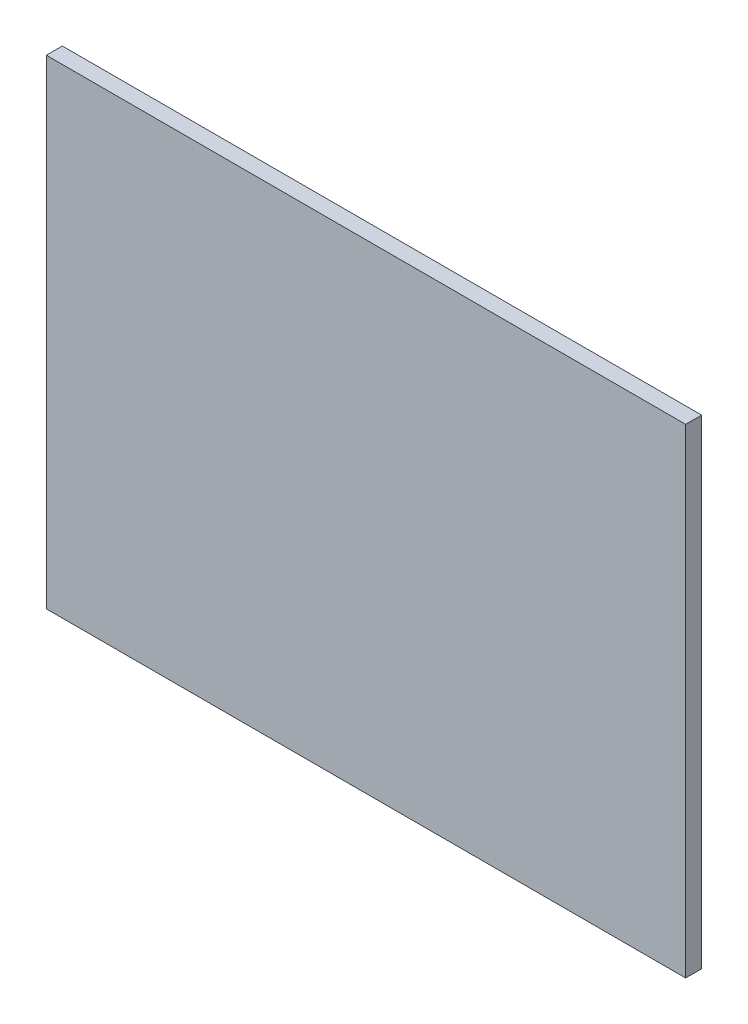
ISO-10303-21;
HEADER;
FILE_DESCRIPTION(('STEP AP214'),'2;1');
FILE_NAME('part.step','',(''),(''),'','','');
FILE_SCHEMA(('AUTOMOTIVE_DESIGN { 1 0 10303 214 1 1 1 1 }'));
ENDSEC;
DATA;
#1=APPLICATION_CONTEXT('core data for automotive mechanical design processes');
#2=APPLICATION_PROTOCOL_DEFINITION('international standard','automotive_design',2000,#1);
#3=PRODUCT_CONTEXT('',#1,'mechanical');
#4=PRODUCT('Part','Part','',(#3));
#5=PRODUCT_RELATED_PRODUCT_CATEGORY('part','',(#4));
#6=PRODUCT_DEFINITION_FORMATION('','',#4);
#7=PRODUCT_DEFINITION_CONTEXT('part definition',#1,'design');
#8=PRODUCT_DEFINITION('design','',#6,#7);
#9=PRODUCT_DEFINITION_SHAPE('','',#8);
#10=(LENGTH_UNIT() NAMED_UNIT(*) SI_UNIT(.MILLI.,.METRE.));
#11=(NAMED_UNIT(*) PLANE_ANGLE_UNIT() SI_UNIT($,.RADIAN.));
#12=(NAMED_UNIT(*) SI_UNIT($,.STERADIAN.) SOLID_ANGLE_UNIT());
#13=UNCERTAINTY_MEASURE_WITH_UNIT(LENGTH_MEASURE(1.E-05),#10,'distance_accuracy_value','');
#14=(GEOMETRIC_REPRESENTATION_CONTEXT(3) GLOBAL_UNCERTAINTY_ASSIGNED_CONTEXT((#13)) GLOBAL_UNIT_ASSIGNED_CONTEXT((#10,
#11,#12)) REPRESENTATION_CONTEXT('',''));
#15=CARTESIAN_POINT('',(0.,0.,0.));
#16=DIRECTION('',(0.,0.,1.));
#17=DIRECTION('',(1.,0.,0.));
#18=AXIS2_PLACEMENT_3D('',#15,#16,#17);
#19=CARTESIAN_POINT('',(-65.8695652173913,48.5869565217391,2.));
#20=DIRECTION('',(1.,0.,0.));
#21=DIRECTION('',(0.,1.,0.));
#22=AXIS2_PLACEMENT_3D('',#19,#20,#21);
#23=PLANE('',#22);
#24=DIRECTION('',(0.,-1.,0.));
#25=VECTOR('',#24,1.);
#26=CARTESIAN_POINT('',(-65.8695652173913,48.5869565217391,0.));
#27=LINE('',#26,#25);
#28=CARTESIAN_POINT('',(-65.8695652173913,48.5869565217391,0.));
#29=VERTEX_POINT('',#28);
#30=CARTESIAN_POINT('',(-65.8695652173913,-11.4130434782609,0.));
#31=VERTEX_POINT('',#30);
#32=EDGE_CURVE('E96',#29,#31,#27,.T.);
#33=ORIENTED_EDGE('',*,*,#32,.T.);
#34=DIRECTION('',(0.,0.,-1.));
#35=VECTOR('',#34,1.);
#36=CARTESIAN_POINT('',(-65.8695652173913,-11.4130434782609,2.));
#37=LINE('',#36,#35);
#38=CARTESIAN_POINT('',(-65.8695652173913,-11.4130434782609,2.));
#39=VERTEX_POINT('',#38);
#40=EDGE_CURVE('E11',#39,#31,#37,.T.);
#41=ORIENTED_EDGE('',*,*,#40,.F.);
#42=DIRECTION('',(0.,-1.,0.));
#43=VECTOR('',#42,1.);
#44=CARTESIAN_POINT('',(-65.8695652173913,48.5869565217391,2.));
#45=LINE('',#44,#43);
#46=CARTESIAN_POINT('',(-65.8695652173913,48.5869565217391,2.));
#47=VERTEX_POINT('',#46);
#48=EDGE_CURVE('E84',#47,#39,#45,.T.);
#49=ORIENTED_EDGE('',*,*,#48,.F.);
#50=DIRECTION('',(0.,0.,-1.));
#51=VECTOR('',#50,1.);
#52=CARTESIAN_POINT('',(-65.8695652173913,48.5869565217391,2.));
#53=LINE('',#52,#51);
#54=EDGE_CURVE('E92',#47,#29,#53,.T.);
#55=ORIENTED_EDGE('',*,*,#54,.T.);
#56=EDGE_LOOP('',(#33,#41,#49,#55));
#57=FACE_BOUND('',#56,.T.);
#58=ADVANCED_FACE('F33',(#57),#23,.F.);
#59=CARTESIAN_POINT('',(-65.8695652173913,-11.4130434782609,2.));
#60=DIRECTION('',(0.,1.,0.));
#61=DIRECTION('',(0.,0.,1.));
#62=AXIS2_PLACEMENT_3D('',#59,#60,#61);
#63=PLANE('',#62);
#64=DIRECTION('',(1.,0.,0.));
#65=VECTOR('',#64,1.);
#66=CARTESIAN_POINT('',(-65.8695652173913,-11.4130434782609,0.));
#67=LINE('',#66,#65);
#68=CARTESIAN_POINT('',(14.1304347826087,-11.4130434782609,0.));
#69=VERTEX_POINT('',#68);
#70=EDGE_CURVE('E88',#31,#69,#67,.T.);
#71=ORIENTED_EDGE('',*,*,#70,.T.);
#72=DIRECTION('',(0.,0.,-1.));
#73=VECTOR('',#72,1.);
#74=CARTESIAN_POINT('',(14.1304347826087,-11.4130434782609,2.));
#75=LINE('',#74,#73);
#76=CARTESIAN_POINT('',(14.1304347826087,-11.4130434782609,2.));
#77=VERTEX_POINT('',#76);
#78=EDGE_CURVE('E41',#77,#69,#75,.T.);
#79=ORIENTED_EDGE('',*,*,#78,.F.);
#80=DIRECTION('',(1.,0.,0.));
#81=VECTOR('',#80,1.);
#82=CARTESIAN_POINT('',(-65.8695652173913,-11.4130434782609,2.));
#83=LINE('',#82,#81);
#84=EDGE_CURVE('E79',#39,#77,#83,.T.);
#85=ORIENTED_EDGE('',*,*,#84,.F.);
#86=ORIENTED_EDGE('',*,*,#40,.T.);
#87=EDGE_LOOP('',(#71,#79,#85,#86));
#88=FACE_BOUND('',#87,.T.);
#89=ADVANCED_FACE('F87',(#88),#63,.F.);
#90=CARTESIAN_POINT('',(14.1304347826087,48.5869565217391,2.));
#91=DIRECTION('',(-1.,0.,0.));
#92=DIRECTION('',(0.,-1.,0.));
#93=AXIS2_PLACEMENT_3D('',#90,#91,#92);
#94=PLANE('',#93);
#95=DIRECTION('',(0.,1.,0.));
#96=VECTOR('',#95,1.);
#97=CARTESIAN_POINT('',(14.1304347826087,48.5869565217391,0.));
#98=LINE('',#97,#96);
#99=CARTESIAN_POINT('',(14.1304347826087,48.5869565217391,0.));
#100=VERTEX_POINT('',#99);
#101=EDGE_CURVE('E66',#69,#100,#98,.T.);
#102=ORIENTED_EDGE('',*,*,#101,.T.);
#103=DIRECTION('',(0.,0.,-1.));
#104=VECTOR('',#103,1.);
#105=CARTESIAN_POINT('',(14.1304347826087,48.5869565217391,2.));
#106=LINE('',#105,#104);
#107=CARTESIAN_POINT('',(14.1304347826087,48.5869565217391,2.));
#108=VERTEX_POINT('',#107);
#109=EDGE_CURVE('E89',#108,#100,#106,.T.);
#110=ORIENTED_EDGE('',*,*,#109,.F.);
#111=DIRECTION('',(0.,1.,0.));
#112=VECTOR('',#111,1.);
#113=CARTESIAN_POINT('',(14.1304347826087,48.5869565217391,2.));
#114=LINE('',#113,#112);
#115=EDGE_CURVE('E82',#77,#108,#114,.T.);
#116=ORIENTED_EDGE('',*,*,#115,.F.);
#117=ORIENTED_EDGE('',*,*,#78,.T.);
#118=EDGE_LOOP('',(#102,#110,#116,#117));
#119=FACE_BOUND('',#118,.T.);
#120=ADVANCED_FACE('F90',(#119),#94,.F.);
#121=CARTESIAN_POINT('',(-65.8695652173913,48.5869565217391,2.));
#122=DIRECTION('',(0.,-1.,0.));
#123=DIRECTION('',(0.,0.,-1.));
#124=AXIS2_PLACEMENT_3D('',#121,#122,#123);
#125=PLANE('',#124);
#126=DIRECTION('',(-1.,0.,0.));
#127=VECTOR('',#126,1.);
#128=CARTESIAN_POINT('',(-65.8695652173913,48.5869565217391,0.));
#129=LINE('',#128,#127);
#130=EDGE_CURVE('E72',#100,#29,#129,.T.);
#131=ORIENTED_EDGE('',*,*,#130,.T.);
#132=ORIENTED_EDGE('',*,*,#54,.F.);
#133=DIRECTION('',(-1.,0.,0.));
#134=VECTOR('',#133,1.);
#135=CARTESIAN_POINT('',(-65.8695652173913,48.5869565217391,2.));
#136=LINE('',#135,#134);
#137=EDGE_CURVE('E49',#108,#47,#136,.T.);
#138=ORIENTED_EDGE('',*,*,#137,.F.);
#139=ORIENTED_EDGE('',*,*,#109,.T.);
#140=EDGE_LOOP('',(#131,#132,#138,#139));
#141=FACE_BOUND('',#140,.T.);
#142=ADVANCED_FACE('F103',(#141),#125,.F.);
#143=CARTESIAN_POINT('',(0.,0.,2.));
#144=DIRECTION('',(0.,0.,1.));
#145=DIRECTION('',(1.,0.,0.));
#146=AXIS2_PLACEMENT_3D('',#143,#144,#145);
#147=PLANE('',#146);
#148=ORIENTED_EDGE('',*,*,#48,.T.);
#149=ORIENTED_EDGE('',*,*,#84,.T.);
#150=ORIENTED_EDGE('',*,*,#115,.T.);
#151=ORIENTED_EDGE('',*,*,#137,.T.);
#152=EDGE_LOOP('',(#148,#149,#150,#151));
#153=FACE_BOUND('',#152,.T.);
#154=ADVANCED_FACE('F80',(#153),#147,.T.);
#155=CARTESIAN_POINT('',(0.,0.,0.));
#156=DIRECTION('',(0.,0.,1.));
#157=DIRECTION('',(1.,0.,0.));
#158=AXIS2_PLACEMENT_3D('',#155,#156,#157);
#159=PLANE('',#158);
#160=ORIENTED_EDGE('',*,*,#32,.F.);
#161=ORIENTED_EDGE('',*,*,#130,.F.);
#162=ORIENTED_EDGE('',*,*,#101,.F.);
#163=ORIENTED_EDGE('',*,*,#70,.F.);
#164=EDGE_LOOP('',(#160,#161,#162,#163));
#165=FACE_BOUND('',#164,.T.);
#166=ADVANCED_FACE('F106',(#165),#159,.F.);
#167=CLOSED_SHELL('',(#58,#89,#120,#142,#154,#166));
#168=MANIFOLD_SOLID_BREP('B2',#167);
#169=ADVANCED_BREP_SHAPE_REPRESENTATION('',(#18,#168),#14);
#170=SHAPE_DEFINITION_REPRESENTATION(#9,#169);
ENDSEC;
END-ISO-10303-21;
